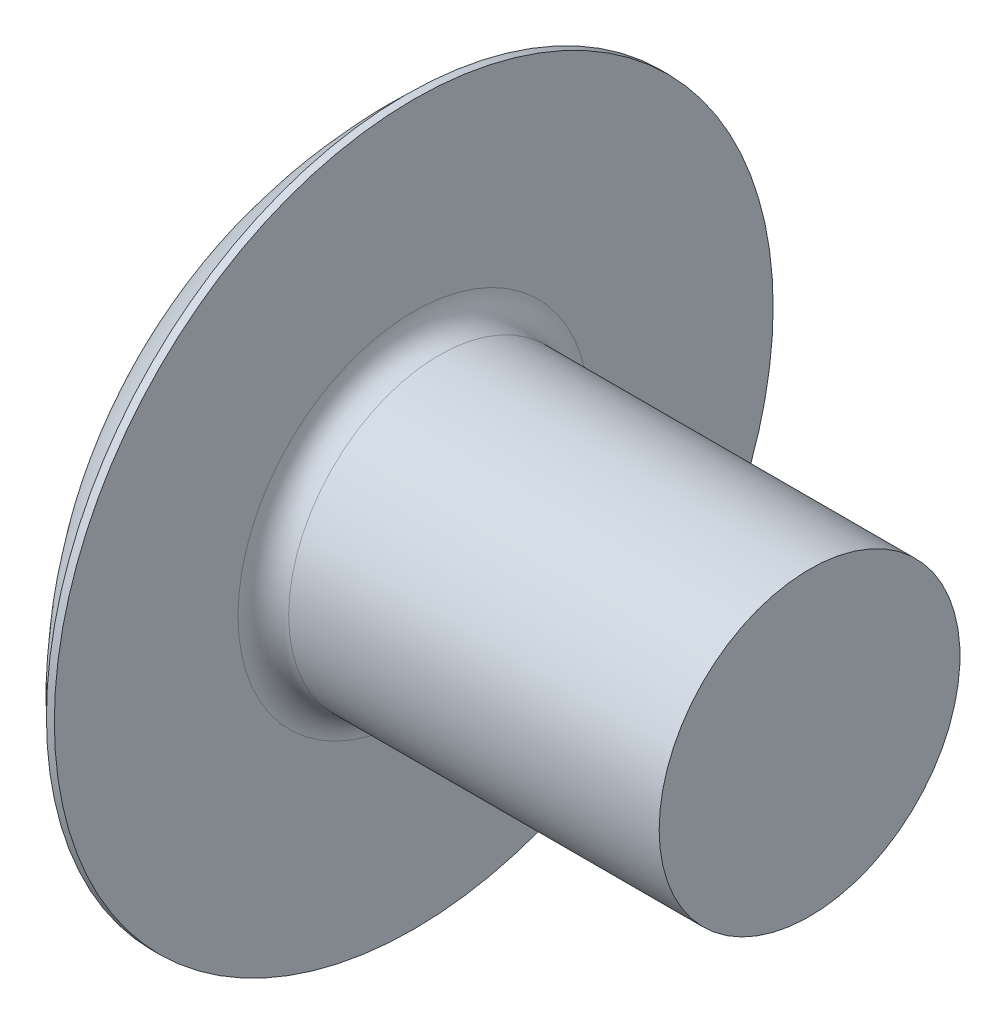
ISO-10303-21;
HEADER;
FILE_DESCRIPTION(('STEP AP214'),'2;1');
FILE_NAME('part.step','',(''),(''),'','','');
FILE_SCHEMA(('AUTOMOTIVE_DESIGN { 1 0 10303 214 1 1 1 1 }'));
ENDSEC;
DATA;
#1=APPLICATION_CONTEXT('core data for automotive mechanical design processes');
#2=APPLICATION_PROTOCOL_DEFINITION('international standard','automotive_design',2000,#1);
#3=PRODUCT_CONTEXT('',#1,'mechanical');
#4=PRODUCT('Part','Part','',(#3));
#5=PRODUCT_RELATED_PRODUCT_CATEGORY('part','',(#4));
#6=PRODUCT_DEFINITION_FORMATION('','',#4);
#7=PRODUCT_DEFINITION_CONTEXT('part definition',#1,'design');
#8=PRODUCT_DEFINITION('design','',#6,#7);
#9=PRODUCT_DEFINITION_SHAPE('','',#8);
#10=(LENGTH_UNIT() NAMED_UNIT(*) SI_UNIT(.MILLI.,.METRE.));
#11=(NAMED_UNIT(*) PLANE_ANGLE_UNIT() SI_UNIT($,.RADIAN.));
#12=(NAMED_UNIT(*) SI_UNIT($,.STERADIAN.) SOLID_ANGLE_UNIT());
#13=UNCERTAINTY_MEASURE_WITH_UNIT(LENGTH_MEASURE(1.E-05),#10,'distance_accuracy_value','');
#14=(GEOMETRIC_REPRESENTATION_CONTEXT(3) GLOBAL_UNCERTAINTY_ASSIGNED_CONTEXT((#13)) GLOBAL_UNIT_ASSIGNED_CONTEXT((#10,
#11,#12)) REPRESENTATION_CONTEXT('',''));
#15=CARTESIAN_POINT('',(0.,0.,0.));
#16=DIRECTION('',(0.,0.,1.));
#17=DIRECTION('',(1.,0.,0.));
#18=AXIS2_PLACEMENT_3D('',#15,#16,#17);
#19=CARTESIAN_POINT('',(7.86758585858585,0.,0.));
#20=DIRECTION('',(-1.,0.,0.));
#21=DIRECTION('',(0.,1.,0.));
#22=AXIS2_PLACEMENT_3D('',#19,#20,#21);
#23=SPHERICAL_SURFACE('',#22,7.86758585858585);
#24=CARTESIAN_POINT('',(2.5146,0.,0.));
#25=DIRECTION('',(-1.,0.,0.));
#26=DIRECTION('',(0.,0.,1.));
#27=AXIS2_PLACEMENT_3D('',#24,#25,#26);
#28=CIRCLE('',#27,5.7658);
#29=CARTESIAN_POINT('',(2.5146,0.,5.7658));
#30=VERTEX_POINT('',#29);
#31=EDGE_CURVE('E52',#30,#30,#28,.T.);
#32=ORIENTED_EDGE('',*,*,#31,.T.);
#33=EDGE_LOOP('',(#32));
#34=FACE_BOUND('',#33,.T.);
#35=ADVANCED_FACE('F33',(#34),#23,.T.);
#36=CARTESIAN_POINT('',(8.9916,2.413,0.));
#37=DIRECTION('',(1.,0.,0.));
#38=DIRECTION('',(0.,0.,-1.));
#39=AXIS2_PLACEMENT_3D('',#36,#37,#38);
#40=PLANE('',#39);
#41=CARTESIAN_POINT('',(8.9916,0.,0.));
#42=DIRECTION('',(-1.,0.,0.));
#43=DIRECTION('',(0.,0.,1.));
#44=AXIS2_PLACEMENT_3D('',#41,#42,#43);
#45=CIRCLE('',#44,2.413);
#46=CARTESIAN_POINT('',(8.9916,0.,2.413));
#47=VERTEX_POINT('',#46);
#48=EDGE_CURVE('E10',#47,#47,#45,.T.);
#49=ORIENTED_EDGE('',*,*,#48,.F.);
#50=EDGE_LOOP('',(#49));
#51=FACE_BOUND('',#50,.T.);
#52=ADVANCED_FACE('F75',(#51),#40,.T.);
#53=CARTESIAN_POINT('',(0.,0.,0.));
#54=DIRECTION('',(-1.,0.,0.));
#55=DIRECTION('',(0.,0.,1.));
#56=AXIS2_PLACEMENT_3D('',#53,#54,#55);
#57=CYLINDRICAL_SURFACE('',#56,2.413);
#58=ORIENTED_EDGE('',*,*,#48,.T.);
#59=EDGE_LOOP('',(#58));
#60=FACE_BOUND('',#59,.T.);
#61=CARTESIAN_POINT('',(3.048,0.,0.));
#62=DIRECTION('',(-1.,0.,0.));
#63=DIRECTION('',(0.,0.,1.));
#64=AXIS2_PLACEMENT_3D('',#61,#62,#63);
#65=CIRCLE('',#64,2.413);
#66=CARTESIAN_POINT('',(3.048,0.,2.413));
#67=VERTEX_POINT('',#66);
#68=EDGE_CURVE('E39',#67,#67,#65,.T.);
#69=ORIENTED_EDGE('',*,*,#68,.F.);
#70=EDGE_LOOP('',(#69));
#71=FACE_BOUND('',#70,.T.);
#72=ADVANCED_FACE('F71',(#60,#71),#57,.T.);
#73=CARTESIAN_POINT('',(3.048,0.,0.));
#74=DIRECTION('',(-1.,0.,0.));
#75=DIRECTION('',(0.,0.,1.));
#76=AXIS2_PLACEMENT_3D('',#73,#74,#75);
#77=TOROIDAL_SURFACE('',#76,2.8194,0.4064);
#78=CARTESIAN_POINT('',(2.6416,0.,0.));
#79=DIRECTION('',(-1.,0.,0.));
#80=DIRECTION('',(0.,0.,1.));
#81=AXIS2_PLACEMENT_3D('',#78,#79,#80);
#82=CIRCLE('',#81,2.8194);
#83=CARTESIAN_POINT('',(2.6416,0.,2.8194));
#84=VERTEX_POINT('',#83);
#85=EDGE_CURVE('E43',#84,#84,#82,.T.);
#86=ORIENTED_EDGE('',*,*,#85,.F.);
#87=EDGE_LOOP('',(#86));
#88=FACE_BOUND('',#87,.T.);
#89=ORIENTED_EDGE('',*,*,#68,.T.);
#90=EDGE_LOOP('',(#89));
#91=FACE_BOUND('',#90,.T.);
#92=ADVANCED_FACE('F65',(#88,#91),#77,.F.);
#93=CARTESIAN_POINT('',(2.6416,5.7658,0.));
#94=DIRECTION('',(1.,0.,0.));
#95=DIRECTION('',(0.,0.,-1.));
#96=AXIS2_PLACEMENT_3D('',#93,#94,#95);
#97=PLANE('',#96);
#98=ORIENTED_EDGE('',*,*,#85,.T.);
#99=EDGE_LOOP('',(#98));
#100=FACE_BOUND('',#99,.T.);
#101=CARTESIAN_POINT('',(2.6416,0.,0.));
#102=DIRECTION('',(-1.,0.,0.));
#103=DIRECTION('',(0.,0.,1.));
#104=AXIS2_PLACEMENT_3D('',#101,#102,#103);
#105=CIRCLE('',#104,5.7658);
#106=CARTESIAN_POINT('',(2.6416,0.,5.7658));
#107=VERTEX_POINT('',#106);
#108=EDGE_CURVE('E47',#107,#107,#105,.T.);
#109=ORIENTED_EDGE('',*,*,#108,.F.);
#110=EDGE_LOOP('',(#109));
#111=FACE_BOUND('',#110,.T.);
#112=ADVANCED_FACE('F60',(#100,#111),#97,.T.);
#113=CARTESIAN_POINT('',(0.,0.,0.));
#114=DIRECTION('',(-1.,0.,0.));
#115=DIRECTION('',(0.,0.,1.));
#116=AXIS2_PLACEMENT_3D('',#113,#114,#115);
#117=CYLINDRICAL_SURFACE('',#116,5.7658);
#118=ORIENTED_EDGE('',*,*,#31,.F.);
#119=EDGE_LOOP('',(#118));
#120=FACE_BOUND('',#119,.T.);
#121=ORIENTED_EDGE('',*,*,#108,.T.);
#122=EDGE_LOOP('',(#121));
#123=FACE_BOUND('',#122,.T.);
#124=ADVANCED_FACE('F57',(#120,#123),#117,.T.);
#125=CLOSED_SHELL('',(#35,#52,#72,#92,#112,#124));
#126=MANIFOLD_SOLID_BREP('B2',#125);
#127=ADVANCED_BREP_SHAPE_REPRESENTATION('',(#18,#126),#14);
#128=SHAPE_DEFINITION_REPRESENTATION(#9,#127);
ENDSEC;
END-ISO-10303-21;
